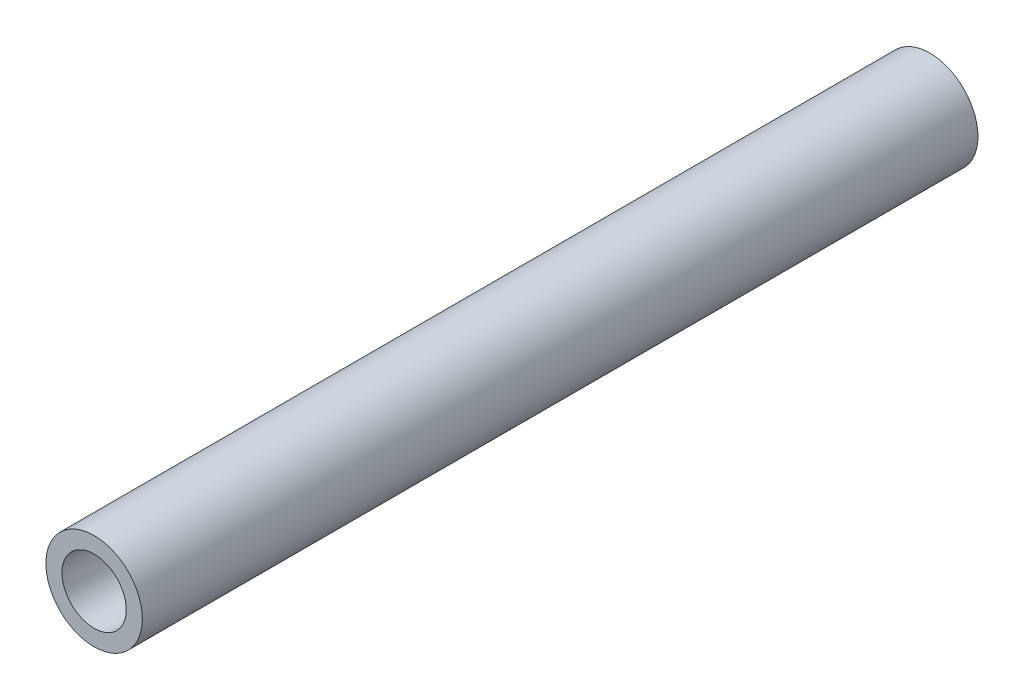
ISO-10303-21;
HEADER;
FILE_DESCRIPTION(('STEP AP214'),'2;1');
FILE_NAME('part.step','',(''),(''),'','','');
FILE_SCHEMA(('AUTOMOTIVE_DESIGN { 1 0 10303 214 1 1 1 1 }'));
ENDSEC;
DATA;
#1=APPLICATION_CONTEXT('core data for automotive mechanical design processes');
#2=APPLICATION_PROTOCOL_DEFINITION('international standard','automotive_design',2000,#1);
#3=PRODUCT_CONTEXT('',#1,'mechanical');
#4=PRODUCT('Part','Part','',(#3));
#5=PRODUCT_RELATED_PRODUCT_CATEGORY('part','',(#4));
#6=PRODUCT_DEFINITION_FORMATION('','',#4);
#7=PRODUCT_DEFINITION_CONTEXT('part definition',#1,'design');
#8=PRODUCT_DEFINITION('design','',#6,#7);
#9=PRODUCT_DEFINITION_SHAPE('','',#8);
#10=(LENGTH_UNIT() NAMED_UNIT(*) SI_UNIT(.MILLI.,.METRE.));
#11=(NAMED_UNIT(*) PLANE_ANGLE_UNIT() SI_UNIT($,.RADIAN.));
#12=(NAMED_UNIT(*) SI_UNIT($,.STERADIAN.) SOLID_ANGLE_UNIT());
#13=UNCERTAINTY_MEASURE_WITH_UNIT(LENGTH_MEASURE(1.E-05),#10,'distance_accuracy_value','');
#14=(GEOMETRIC_REPRESENTATION_CONTEXT(3) GLOBAL_UNCERTAINTY_ASSIGNED_CONTEXT((#13)) GLOBAL_UNIT_ASSIGNED_CONTEXT((#10,
#11,#12)) REPRESENTATION_CONTEXT('',''));
#15=CARTESIAN_POINT('',(0.,0.,0.));
#16=DIRECTION('',(0.,0.,1.));
#17=DIRECTION('',(1.,0.,0.));
#18=AXIS2_PLACEMENT_3D('',#15,#16,#17);
#19=CARTESIAN_POINT('',(0.,0.,-65.));
#20=DIRECTION('',(0.,0.,1.));
#21=DIRECTION('',(1.,0.,0.));
#22=AXIS2_PLACEMENT_3D('',#19,#20,#21);
#23=CYLINDRICAL_SURFACE('',#22,7.5);
#24=CARTESIAN_POINT('',(0.,0.,-65.));
#25=DIRECTION('',(0.,0.,1.));
#26=DIRECTION('',(1.,0.,0.));
#27=AXIS2_PLACEMENT_3D('',#24,#25,#26);
#28=CIRCLE('',#27,7.5);
#29=CARTESIAN_POINT('',(7.5,0.,-65.));
#30=VERTEX_POINT('',#29);
#31=EDGE_CURVE('E10',#30,#30,#28,.T.);
#32=ORIENTED_EDGE('',*,*,#31,.T.);
#33=EDGE_LOOP('',(#32));
#34=FACE_BOUND('',#33,.T.);
#35=CARTESIAN_POINT('',(0.,0.,65.));
#36=DIRECTION('',(0.,0.,1.));
#37=DIRECTION('',(1.,0.,0.));
#38=AXIS2_PLACEMENT_3D('',#35,#36,#37);
#39=CIRCLE('',#38,7.5);
#40=CARTESIAN_POINT('',(7.5,0.,65.));
#41=VERTEX_POINT('',#40);
#42=EDGE_CURVE('E41',#41,#41,#39,.T.);
#43=ORIENTED_EDGE('',*,*,#42,.F.);
#44=EDGE_LOOP('',(#43));
#45=FACE_BOUND('',#44,.T.);
#46=ADVANCED_FACE('F31',(#34,#45),#23,.T.);
#47=CARTESIAN_POINT('',(0.,0.,-65.));
#48=DIRECTION('',(0.,0.,1.));
#49=DIRECTION('',(1.,0.,0.));
#50=AXIS2_PLACEMENT_3D('',#47,#48,#49);
#51=PLANE('',#50);
#52=CARTESIAN_POINT('',(0.,0.,-65.));
#53=DIRECTION('',(0.,0.,1.));
#54=DIRECTION('',(1.,0.,0.));
#55=AXIS2_PLACEMENT_3D('',#52,#53,#54);
#56=CIRCLE('',#55,5.);
#57=CARTESIAN_POINT('',(5.,0.,-65.));
#58=VERTEX_POINT('',#57);
#59=EDGE_CURVE('E37',#58,#58,#56,.T.);
#60=ORIENTED_EDGE('',*,*,#59,.T.);
#61=EDGE_LOOP('',(#60));
#62=FACE_BOUND('',#61,.T.);
#63=ORIENTED_EDGE('',*,*,#31,.F.);
#64=EDGE_LOOP('',(#63));
#65=FACE_BOUND('',#64,.T.);
#66=ADVANCED_FACE('F60',(#62,#65),#51,.F.);
#67=CARTESIAN_POINT('',(0.,0.,-65.));
#68=DIRECTION('',(0.,0.,1.));
#69=DIRECTION('',(1.,0.,0.));
#70=AXIS2_PLACEMENT_3D('',#67,#68,#69);
#71=CYLINDRICAL_SURFACE('',#70,5.);
#72=ORIENTED_EDGE('',*,*,#59,.F.);
#73=EDGE_LOOP('',(#72));
#74=FACE_BOUND('',#73,.T.);
#75=CARTESIAN_POINT('',(0.,0.,65.));
#76=DIRECTION('',(0.,0.,1.));
#77=DIRECTION('',(1.,0.,0.));
#78=AXIS2_PLACEMENT_3D('',#75,#76,#77);
#79=CIRCLE('',#78,5.);
#80=CARTESIAN_POINT('',(5.,0.,65.));
#81=VERTEX_POINT('',#80);
#82=EDGE_CURVE('E45',#81,#81,#79,.T.);
#83=ORIENTED_EDGE('',*,*,#82,.T.);
#84=EDGE_LOOP('',(#83));
#85=FACE_BOUND('',#84,.T.);
#86=ADVANCED_FACE('F51',(#74,#85),#71,.F.);
#87=CARTESIAN_POINT('',(0.,0.,65.));
#88=DIRECTION('',(0.,0.,1.));
#89=DIRECTION('',(1.,0.,0.));
#90=AXIS2_PLACEMENT_3D('',#87,#88,#89);
#91=PLANE('',#90);
#92=ORIENTED_EDGE('',*,*,#42,.T.);
#93=EDGE_LOOP('',(#92));
#94=FACE_BOUND('',#93,.T.);
#95=ORIENTED_EDGE('',*,*,#82,.F.);
#96=EDGE_LOOP('',(#95));
#97=FACE_BOUND('',#96,.T.);
#98=ADVANCED_FACE('F53',(#94,#97),#91,.T.);
#99=CLOSED_SHELL('',(#46,#66,#86,#98));
#100=MANIFOLD_SOLID_BREP('B2',#99);
#101=ADVANCED_BREP_SHAPE_REPRESENTATION('',(#18,#100),#14);
#102=SHAPE_DEFINITION_REPRESENTATION(#9,#101);
ENDSEC;
END-ISO-10303-21;
